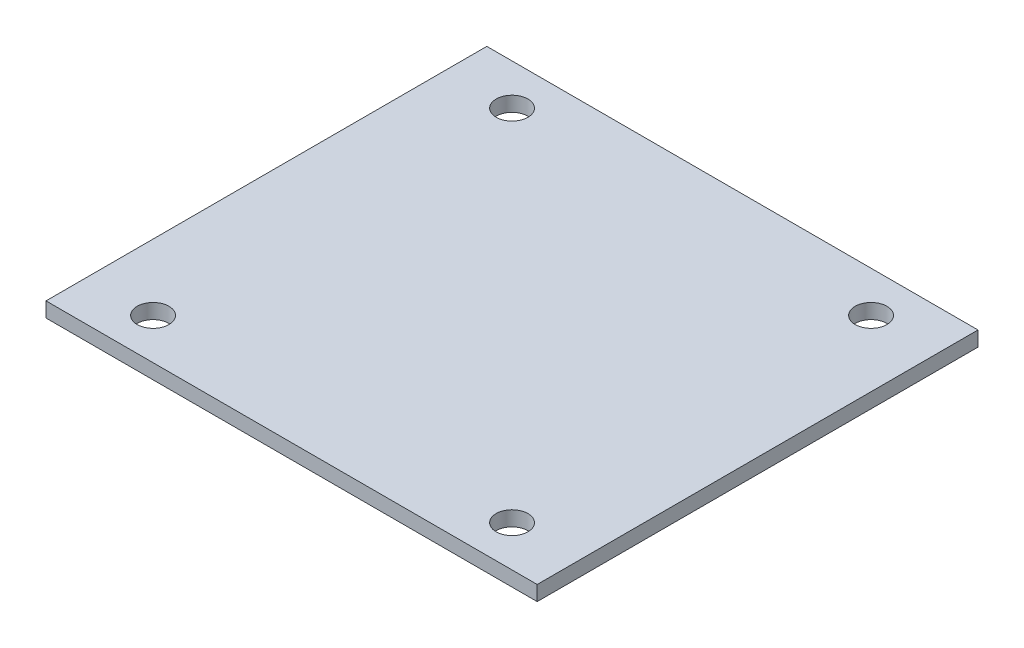
ISO-10303-21;
HEADER;
FILE_DESCRIPTION(('STEP AP214'),'2;1');
FILE_NAME('part.step','',(''),(''),'','','');
FILE_SCHEMA(('AUTOMOTIVE_DESIGN { 1 0 10303 214 1 1 1 1 }'));
ENDSEC;
DATA;
#1=APPLICATION_CONTEXT('core data for automotive mechanical design processes');
#2=APPLICATION_PROTOCOL_DEFINITION('international standard','automotive_design',2000,#1);
#3=PRODUCT_CONTEXT('',#1,'mechanical');
#4=PRODUCT('Part','Part','',(#3));
#5=PRODUCT_RELATED_PRODUCT_CATEGORY('part','',(#4));
#6=PRODUCT_DEFINITION_FORMATION('','',#4);
#7=PRODUCT_DEFINITION_CONTEXT('part definition',#1,'design');
#8=PRODUCT_DEFINITION('design','',#6,#7);
#9=PRODUCT_DEFINITION_SHAPE('','',#8);
#10=(LENGTH_UNIT() NAMED_UNIT(*) SI_UNIT(.MILLI.,.METRE.));
#11=(NAMED_UNIT(*) PLANE_ANGLE_UNIT() SI_UNIT($,.RADIAN.));
#12=(NAMED_UNIT(*) SI_UNIT($,.STERADIAN.) SOLID_ANGLE_UNIT());
#13=UNCERTAINTY_MEASURE_WITH_UNIT(LENGTH_MEASURE(1.E-05),#10,'distance_accuracy_value','');
#14=(GEOMETRIC_REPRESENTATION_CONTEXT(3) GLOBAL_UNCERTAINTY_ASSIGNED_CONTEXT((#13)) GLOBAL_UNIT_ASSIGNED_CONTEXT((#10,
#11,#12)) REPRESENTATION_CONTEXT('',''));
#15=CARTESIAN_POINT('',(0.,0.,0.));
#16=DIRECTION('',(0.,0.,1.));
#17=DIRECTION('',(1.,0.,0.));
#18=AXIS2_PLACEMENT_3D('',#15,#16,#17);
#19=CARTESIAN_POINT('',(0.,1.5,0.));
#20=DIRECTION('',(0.,1.,0.));
#21=DIRECTION('',(0.,0.,1.));
#22=AXIS2_PLACEMENT_3D('',#19,#20,#21);
#23=PLANE('',#22);
#24=CARTESIAN_POINT('',(42.8675,1.5,-40.3275));
#25=DIRECTION('',(0.,1.,0.));
#26=DIRECTION('',(0.,0.,1.));
#27=AXIS2_PLACEMENT_3D('',#24,#25,#26);
#28=CIRCLE('',#27,1.6);
#29=CARTESIAN_POINT('',(42.8675,1.5,-38.7275));
#30=VERTEX_POINT('',#29);
#31=EDGE_CURVE('E121',#30,#30,#28,.T.);
#32=ORIENTED_EDGE('',*,*,#31,.F.);
#33=EDGE_LOOP('',(#32));
#34=FACE_BOUND('',#33,.T.);
#35=CARTESIAN_POINT('',(6.66750000000001,1.5,-4.12749999999998));
#36=DIRECTION('',(0.,1.,0.));
#37=DIRECTION('',(0.,0.,1.));
#38=AXIS2_PLACEMENT_3D('',#35,#36,#37);
#39=CIRCLE('',#38,1.6);
#40=CARTESIAN_POINT('',(6.66750000000001,1.5,-2.52749999999998));
#41=VERTEX_POINT('',#40);
#42=EDGE_CURVE('E100',#41,#41,#39,.T.);
#43=ORIENTED_EDGE('',*,*,#42,.F.);
#44=EDGE_LOOP('',(#43));
#45=FACE_BOUND('',#44,.T.);
#46=DIRECTION('',(0.,0.,1.));
#47=VECTOR('',#46,1.);
#48=CARTESIAN_POINT('',(0.,1.5,-44.45));
#49=LINE('',#48,#47);
#50=CARTESIAN_POINT('',(0.,1.5,-44.45));
#51=VERTEX_POINT('',#50);
#52=CARTESIAN_POINT('',(0.,1.5,0.));
#53=VERTEX_POINT('',#52);
#54=EDGE_CURVE('E85',#51,#53,#49,.T.);
#55=ORIENTED_EDGE('',*,*,#54,.T.);
#56=DIRECTION('',(1.,0.,0.));
#57=VECTOR('',#56,1.);
#58=CARTESIAN_POINT('',(0.,1.5,0.));
#59=LINE('',#58,#57);
#60=CARTESIAN_POINT('',(49.53,1.5,0.));
#61=VERTEX_POINT('',#60);
#62=EDGE_CURVE('E80',#53,#61,#59,.T.);
#63=ORIENTED_EDGE('',*,*,#62,.T.);
#64=DIRECTION('',(0.,0.,-1.));
#65=VECTOR('',#64,1.);
#66=CARTESIAN_POINT('',(49.53,1.5,-44.45));
#67=LINE('',#66,#65);
#68=CARTESIAN_POINT('',(49.53,1.5,-44.45));
#69=VERTEX_POINT('',#68);
#70=EDGE_CURVE('E83',#61,#69,#67,.T.);
#71=ORIENTED_EDGE('',*,*,#70,.T.);
#72=DIRECTION('',(-1.,0.,0.));
#73=VECTOR('',#72,1.);
#74=CARTESIAN_POINT('',(0.,1.5,-44.45));
#75=LINE('',#74,#73);
#76=EDGE_CURVE('E50',#69,#51,#75,.T.);
#77=ORIENTED_EDGE('',*,*,#76,.T.);
#78=EDGE_LOOP('',(#55,#63,#71,#77));
#79=FACE_BOUND('',#78,.T.);
#80=CARTESIAN_POINT('',(42.8675,1.5,-4.1275));
#81=DIRECTION('',(0.,1.,0.));
#82=DIRECTION('',(0.,0.,1.));
#83=AXIS2_PLACEMENT_3D('',#80,#81,#82);
#84=CIRCLE('',#83,1.6);
#85=CARTESIAN_POINT('',(42.8675,1.5,-2.5275));
#86=VERTEX_POINT('',#85);
#87=EDGE_CURVE('E115',#86,#86,#84,.T.);
#88=ORIENTED_EDGE('',*,*,#87,.F.);
#89=EDGE_LOOP('',(#88));
#90=FACE_BOUND('',#89,.T.);
#91=CARTESIAN_POINT('',(6.6675,1.5,-40.3275));
#92=DIRECTION('',(0.,1.,0.));
#93=DIRECTION('',(0.,0.,1.));
#94=AXIS2_PLACEMENT_3D('',#91,#92,#93);
#95=CIRCLE('',#94,1.6);
#96=CARTESIAN_POINT('',(6.6675,1.5,-38.7275));
#97=VERTEX_POINT('',#96);
#98=EDGE_CURVE('E127',#97,#97,#95,.T.);
#99=ORIENTED_EDGE('',*,*,#98,.F.);
#100=EDGE_LOOP('',(#99));
#101=FACE_BOUND('',#100,.T.);
#102=ADVANCED_FACE('F33',(#34,#45,#79,#90,#101),#23,.T.);
#103=CARTESIAN_POINT('',(0.,0.,0.));
#104=DIRECTION('',(0.,1.,0.));
#105=DIRECTION('',(0.,0.,1.));
#106=AXIS2_PLACEMENT_3D('',#103,#104,#105);
#107=PLANE('',#106);
#108=CARTESIAN_POINT('',(42.8675,0.,-40.3275));
#109=DIRECTION('',(0.,1.,0.));
#110=DIRECTION('',(0.,0.,1.));
#111=AXIS2_PLACEMENT_3D('',#108,#109,#110);
#112=CIRCLE('',#111,1.6);
#113=CARTESIAN_POINT('',(42.8675,0.,-38.7275));
#114=VERTEX_POINT('',#113);
#115=EDGE_CURVE('E124',#114,#114,#112,.T.);
#116=ORIENTED_EDGE('',*,*,#115,.T.);
#117=EDGE_LOOP('',(#116));
#118=FACE_BOUND('',#117,.T.);
#119=CARTESIAN_POINT('',(6.66750000000001,0.,-4.12749999999998));
#120=DIRECTION('',(0.,1.,0.));
#121=DIRECTION('',(0.,0.,1.));
#122=AXIS2_PLACEMENT_3D('',#119,#120,#121);
#123=CIRCLE('',#122,1.6);
#124=CARTESIAN_POINT('',(6.66750000000001,0.,-2.52749999999998));
#125=VERTEX_POINT('',#124);
#126=EDGE_CURVE('E112',#125,#125,#123,.T.);
#127=ORIENTED_EDGE('',*,*,#126,.T.);
#128=EDGE_LOOP('',(#127));
#129=FACE_BOUND('',#128,.T.);
#130=DIRECTION('',(0.,0.,1.));
#131=VECTOR('',#130,1.);
#132=CARTESIAN_POINT('',(0.,0.,-44.45));
#133=LINE('',#132,#131);
#134=CARTESIAN_POINT('',(0.,0.,-44.45));
#135=VERTEX_POINT('',#134);
#136=CARTESIAN_POINT('',(0.,0.,0.));
#137=VERTEX_POINT('',#136);
#138=EDGE_CURVE('E97',#135,#137,#133,.T.);
#139=ORIENTED_EDGE('',*,*,#138,.F.);
#140=DIRECTION('',(-1.,0.,0.));
#141=VECTOR('',#140,1.);
#142=CARTESIAN_POINT('',(0.,0.,-44.45));
#143=LINE('',#142,#141);
#144=CARTESIAN_POINT('',(49.53,0.,-44.45));
#145=VERTEX_POINT('',#144);
#146=EDGE_CURVE('E73',#145,#135,#143,.T.);
#147=ORIENTED_EDGE('',*,*,#146,.F.);
#148=DIRECTION('',(0.,0.,-1.));
#149=VECTOR('',#148,1.);
#150=CARTESIAN_POINT('',(49.53,0.,-44.45));
#151=LINE('',#150,#149);
#152=CARTESIAN_POINT('',(49.53,0.,0.));
#153=VERTEX_POINT('',#152);
#154=EDGE_CURVE('E67',#153,#145,#151,.T.);
#155=ORIENTED_EDGE('',*,*,#154,.F.);
#156=DIRECTION('',(1.,0.,0.));
#157=VECTOR('',#156,1.);
#158=CARTESIAN_POINT('',(0.,0.,0.));
#159=LINE('',#158,#157);
#160=EDGE_CURVE('E89',#137,#153,#159,.T.);
#161=ORIENTED_EDGE('',*,*,#160,.F.);
#162=EDGE_LOOP('',(#139,#147,#155,#161));
#163=FACE_BOUND('',#162,.T.);
#164=CARTESIAN_POINT('',(42.8675,0.,-4.1275));
#165=DIRECTION('',(0.,1.,0.));
#166=DIRECTION('',(0.,0.,1.));
#167=AXIS2_PLACEMENT_3D('',#164,#165,#166);
#168=CIRCLE('',#167,1.6);
#169=CARTESIAN_POINT('',(42.8675,0.,-2.5275));
#170=VERTEX_POINT('',#169);
#171=EDGE_CURVE('E118',#170,#170,#168,.T.);
#172=ORIENTED_EDGE('',*,*,#171,.T.);
#173=EDGE_LOOP('',(#172));
#174=FACE_BOUND('',#173,.T.);
#175=CARTESIAN_POINT('',(6.6675,0.,-40.3275));
#176=DIRECTION('',(0.,1.,0.));
#177=DIRECTION('',(0.,0.,1.));
#178=AXIS2_PLACEMENT_3D('',#175,#176,#177);
#179=CIRCLE('',#178,1.6);
#180=CARTESIAN_POINT('',(6.6675,0.,-38.7275));
#181=VERTEX_POINT('',#180);
#182=EDGE_CURVE('E130',#181,#181,#179,.T.);
#183=ORIENTED_EDGE('',*,*,#182,.T.);
#184=EDGE_LOOP('',(#183));
#185=FACE_BOUND('',#184,.T.);
#186=ADVANCED_FACE('F108',(#118,#129,#163,#174,#185),#107,.F.);
#187=CARTESIAN_POINT('',(0.,1.5,-44.45));
#188=DIRECTION('',(1.,0.,0.));
#189=DIRECTION('',(0.,0.,-1.));
#190=AXIS2_PLACEMENT_3D('',#187,#188,#189);
#191=PLANE('',#190);
#192=ORIENTED_EDGE('',*,*,#138,.T.);
#193=DIRECTION('',(0.,-1.,0.));
#194=VECTOR('',#193,1.);
#195=CARTESIAN_POINT('',(0.,1.5,0.));
#196=LINE('',#195,#194);
#197=EDGE_CURVE('E11',#53,#137,#196,.T.);
#198=ORIENTED_EDGE('',*,*,#197,.F.);
#199=ORIENTED_EDGE('',*,*,#54,.F.);
#200=DIRECTION('',(0.,-1.,0.));
#201=VECTOR('',#200,1.);
#202=CARTESIAN_POINT('',(0.,1.5,-44.45));
#203=LINE('',#202,#201);
#204=EDGE_CURVE('E93',#51,#135,#203,.T.);
#205=ORIENTED_EDGE('',*,*,#204,.T.);
#206=EDGE_LOOP('',(#192,#198,#199,#205));
#207=FACE_BOUND('',#206,.T.);
#208=ADVANCED_FACE('F35',(#207),#191,.F.);
#209=CARTESIAN_POINT('',(0.,1.5,0.));
#210=DIRECTION('',(0.,0.,-1.));
#211=DIRECTION('',(-1.,0.,0.));
#212=AXIS2_PLACEMENT_3D('',#209,#210,#211);
#213=PLANE('',#212);
#214=ORIENTED_EDGE('',*,*,#160,.T.);
#215=DIRECTION('',(0.,-1.,0.));
#216=VECTOR('',#215,1.);
#217=CARTESIAN_POINT('',(49.53,1.5,0.));
#218=LINE('',#217,#216);
#219=EDGE_CURVE('E42',#61,#153,#218,.T.);
#220=ORIENTED_EDGE('',*,*,#219,.F.);
#221=ORIENTED_EDGE('',*,*,#62,.F.);
#222=ORIENTED_EDGE('',*,*,#197,.T.);
#223=EDGE_LOOP('',(#214,#220,#221,#222));
#224=FACE_BOUND('',#223,.T.);
#225=ADVANCED_FACE('F88',(#224),#213,.F.);
#226=CARTESIAN_POINT('',(49.53,1.5,-44.45));
#227=DIRECTION('',(-1.,0.,0.));
#228=DIRECTION('',(0.,0.,1.));
#229=AXIS2_PLACEMENT_3D('',#226,#227,#228);
#230=PLANE('',#229);
#231=ORIENTED_EDGE('',*,*,#154,.T.);
#232=DIRECTION('',(0.,-1.,0.));
#233=VECTOR('',#232,1.);
#234=CARTESIAN_POINT('',(49.53,1.5,-44.45));
#235=LINE('',#234,#233);
#236=EDGE_CURVE('E90',#69,#145,#235,.T.);
#237=ORIENTED_EDGE('',*,*,#236,.F.);
#238=ORIENTED_EDGE('',*,*,#70,.F.);
#239=ORIENTED_EDGE('',*,*,#219,.T.);
#240=EDGE_LOOP('',(#231,#237,#238,#239));
#241=FACE_BOUND('',#240,.T.);
#242=ADVANCED_FACE('F91',(#241),#230,.F.);
#243=CARTESIAN_POINT('',(0.,1.5,-44.45));
#244=DIRECTION('',(0.,0.,1.));
#245=DIRECTION('',(1.,0.,0.));
#246=AXIS2_PLACEMENT_3D('',#243,#244,#245);
#247=PLANE('',#246);
#248=ORIENTED_EDGE('',*,*,#146,.T.);
#249=ORIENTED_EDGE('',*,*,#204,.F.);
#250=ORIENTED_EDGE('',*,*,#76,.F.);
#251=ORIENTED_EDGE('',*,*,#236,.T.);
#252=EDGE_LOOP('',(#248,#249,#250,#251));
#253=FACE_BOUND('',#252,.T.);
#254=ADVANCED_FACE('F105',(#253),#247,.F.);
#255=CARTESIAN_POINT('',(6.66750000000001,1.5,-4.12749999999998));
#256=DIRECTION('',(0.,-1.,0.));
#257=DIRECTION('',(0.,0.,-1.));
#258=AXIS2_PLACEMENT_3D('',#255,#256,#257);
#259=CYLINDRICAL_SURFACE('',#258,1.6);
#260=ORIENTED_EDGE('',*,*,#42,.T.);
#261=EDGE_LOOP('',(#260));
#262=FACE_BOUND('',#261,.T.);
#263=ORIENTED_EDGE('',*,*,#126,.F.);
#264=EDGE_LOOP('',(#263));
#265=FACE_BOUND('',#264,.T.);
#266=ADVANCED_FACE('F150',(#262,#265),#259,.F.);
#267=CARTESIAN_POINT('',(42.8675,1.5,-4.1275));
#268=DIRECTION('',(0.,-1.,0.));
#269=DIRECTION('',(0.,0.,-1.));
#270=AXIS2_PLACEMENT_3D('',#267,#268,#269);
#271=CYLINDRICAL_SURFACE('',#270,1.6);
#272=ORIENTED_EDGE('',*,*,#87,.T.);
#273=EDGE_LOOP('',(#272));
#274=FACE_BOUND('',#273,.T.);
#275=ORIENTED_EDGE('',*,*,#171,.F.);
#276=EDGE_LOOP('',(#275));
#277=FACE_BOUND('',#276,.T.);
#278=ADVANCED_FACE('F196',(#274,#277),#271,.F.);
#279=CARTESIAN_POINT('',(42.8675,1.5,-40.3275));
#280=DIRECTION('',(0.,-1.,0.));
#281=DIRECTION('',(0.,0.,-1.));
#282=AXIS2_PLACEMENT_3D('',#279,#280,#281);
#283=CYLINDRICAL_SURFACE('',#282,1.6);
#284=ORIENTED_EDGE('',*,*,#31,.T.);
#285=EDGE_LOOP('',(#284));
#286=FACE_BOUND('',#285,.T.);
#287=ORIENTED_EDGE('',*,*,#115,.F.);
#288=EDGE_LOOP('',(#287));
#289=FACE_BOUND('',#288,.T.);
#290=ADVANCED_FACE('F204',(#286,#289),#283,.F.);
#291=CARTESIAN_POINT('',(6.6675,1.5,-40.3275));
#292=DIRECTION('',(0.,-1.,0.));
#293=DIRECTION('',(0.,0.,-1.));
#294=AXIS2_PLACEMENT_3D('',#291,#292,#293);
#295=CYLINDRICAL_SURFACE('',#294,1.6);
#296=ORIENTED_EDGE('',*,*,#98,.T.);
#297=EDGE_LOOP('',(#296));
#298=FACE_BOUND('',#297,.T.);
#299=ORIENTED_EDGE('',*,*,#182,.F.);
#300=EDGE_LOOP('',(#299));
#301=FACE_BOUND('',#300,.T.);
#302=ADVANCED_FACE('F136',(#298,#301),#295,.F.);
#303=CLOSED_SHELL('',(#102,#186,#208,#225,#242,#254,#266,#278,#290,#302));
#304=MANIFOLD_SOLID_BREP('B2',#303);
#305=ADVANCED_BREP_SHAPE_REPRESENTATION('',(#18,#304),#14);
#306=SHAPE_DEFINITION_REPRESENTATION(#9,#305);
ENDSEC;
END-ISO-10303-21;
